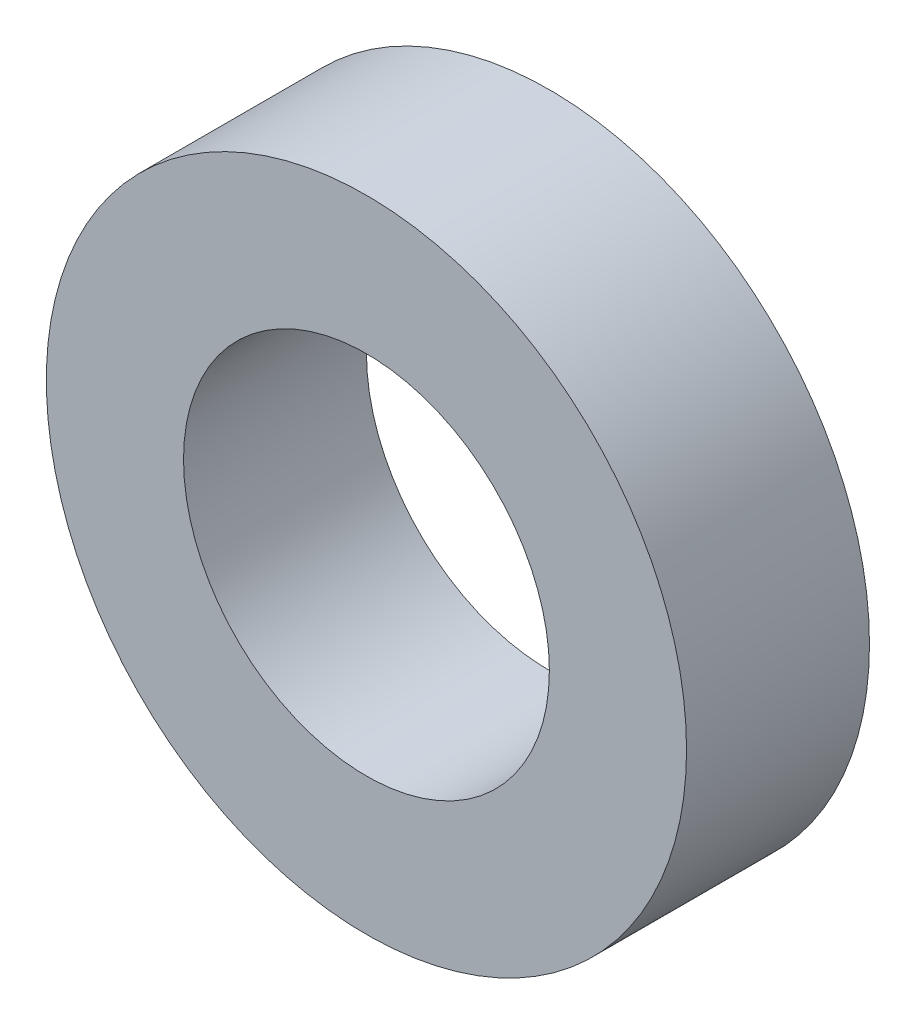
ISO-10303-21;
HEADER;
FILE_DESCRIPTION(('STEP AP214'),'2;1');
FILE_NAME('part.step','',(''),(''),'','','');
FILE_SCHEMA(('AUTOMOTIVE_DESIGN { 1 0 10303 214 1 1 1 1 }'));
ENDSEC;
DATA;
#1=APPLICATION_CONTEXT('core data for automotive mechanical design processes');
#2=APPLICATION_PROTOCOL_DEFINITION('international standard','automotive_design',2000,#1);
#3=PRODUCT_CONTEXT('',#1,'mechanical');
#4=PRODUCT('Part','Part','',(#3));
#5=PRODUCT_RELATED_PRODUCT_CATEGORY('part','',(#4));
#6=PRODUCT_DEFINITION_FORMATION('','',#4);
#7=PRODUCT_DEFINITION_CONTEXT('part definition',#1,'design');
#8=PRODUCT_DEFINITION('design','',#6,#7);
#9=PRODUCT_DEFINITION_SHAPE('','',#8);
#10=(LENGTH_UNIT() NAMED_UNIT(*) SI_UNIT(.MILLI.,.METRE.));
#11=(NAMED_UNIT(*) PLANE_ANGLE_UNIT() SI_UNIT($,.RADIAN.));
#12=(NAMED_UNIT(*) SI_UNIT($,.STERADIAN.) SOLID_ANGLE_UNIT());
#13=UNCERTAINTY_MEASURE_WITH_UNIT(LENGTH_MEASURE(1.E-05),#10,'distance_accuracy_value','');
#14=(GEOMETRIC_REPRESENTATION_CONTEXT(3) GLOBAL_UNCERTAINTY_ASSIGNED_CONTEXT((#13)) GLOBAL_UNIT_ASSIGNED_CONTEXT((#10,
#11,#12)) REPRESENTATION_CONTEXT('',''));
#15=CARTESIAN_POINT('',(0.,0.,0.));
#16=DIRECTION('',(0.,0.,1.));
#17=DIRECTION('',(1.,0.,0.));
#18=AXIS2_PLACEMENT_3D('',#15,#16,#17);
#19=CARTESIAN_POINT('',(0.,0.,1.));
#20=DIRECTION('',(0.,0.,1.));
#21=DIRECTION('',(1.,0.,0.));
#22=AXIS2_PLACEMENT_3D('',#19,#20,#21);
#23=PLANE('',#22);
#24=CARTESIAN_POINT('',(0.,0.,1.));
#25=DIRECTION('',(0.,0.,1.));
#26=DIRECTION('',(1.,0.,0.));
#27=AXIS2_PLACEMENT_3D('',#24,#25,#26);
#28=CIRCLE('',#27,3.5);
#29=CARTESIAN_POINT('',(3.5,0.,1.));
#30=VERTEX_POINT('',#29);
#31=EDGE_CURVE('E10',#30,#30,#28,.T.);
#32=ORIENTED_EDGE('',*,*,#31,.T.);
#33=EDGE_LOOP('',(#32));
#34=FACE_BOUND('',#33,.T.);
#35=CARTESIAN_POINT('',(0.,0.,1.));
#36=DIRECTION('',(0.,0.,1.));
#37=DIRECTION('',(1.,0.,0.));
#38=AXIS2_PLACEMENT_3D('',#35,#36,#37);
#39=CIRCLE('',#38,2.);
#40=CARTESIAN_POINT('',(2.,0.,1.));
#41=VERTEX_POINT('',#40);
#42=EDGE_CURVE('E54',#41,#41,#39,.T.);
#43=ORIENTED_EDGE('',*,*,#42,.F.);
#44=EDGE_LOOP('',(#43));
#45=FACE_BOUND('',#44,.T.);
#46=ADVANCED_FACE('F41',(#34,#45),#23,.T.);
#47=CARTESIAN_POINT('',(0.,0.,-1.));
#48=DIRECTION('',(0.,0.,1.));
#49=DIRECTION('',(1.,0.,0.));
#50=AXIS2_PLACEMENT_3D('',#47,#48,#49);
#51=PLANE('',#50);
#52=CARTESIAN_POINT('',(0.,0.,-1.));
#53=DIRECTION('',(0.,0.,1.));
#54=DIRECTION('',(1.,0.,0.));
#55=AXIS2_PLACEMENT_3D('',#52,#53,#54);
#56=CIRCLE('',#55,3.5);
#57=CARTESIAN_POINT('',(3.5,0.,-1.));
#58=VERTEX_POINT('',#57);
#59=EDGE_CURVE('E45',#58,#58,#56,.T.);
#60=ORIENTED_EDGE('',*,*,#59,.F.);
#61=EDGE_LOOP('',(#60));
#62=FACE_BOUND('',#61,.T.);
#63=CARTESIAN_POINT('',(0.,0.,-1.));
#64=DIRECTION('',(0.,0.,1.));
#65=DIRECTION('',(1.,0.,0.));
#66=AXIS2_PLACEMENT_3D('',#63,#64,#65);
#67=CIRCLE('',#66,2.);
#68=CARTESIAN_POINT('',(2.,0.,-1.));
#69=VERTEX_POINT('',#68);
#70=EDGE_CURVE('E56',#69,#69,#67,.T.);
#71=ORIENTED_EDGE('',*,*,#70,.T.);
#72=EDGE_LOOP('',(#71));
#73=FACE_BOUND('',#72,.T.);
#74=ADVANCED_FACE('F68',(#62,#73),#51,.F.);
#75=CARTESIAN_POINT('',(0.,0.,1.));
#76=DIRECTION('',(0.,0.,-1.));
#77=DIRECTION('',(-1.,0.,0.));
#78=AXIS2_PLACEMENT_3D('',#75,#76,#77);
#79=CYLINDRICAL_SURFACE('',#78,3.5);
#80=ORIENTED_EDGE('',*,*,#31,.F.);
#81=EDGE_LOOP('',(#80));
#82=FACE_BOUND('',#81,.T.);
#83=ORIENTED_EDGE('',*,*,#59,.T.);
#84=EDGE_LOOP('',(#83));
#85=FACE_BOUND('',#84,.T.);
#86=ADVANCED_FACE('F43',(#82,#85),#79,.T.);
#87=CARTESIAN_POINT('',(0.,0.,1.));
#88=DIRECTION('',(0.,0.,-1.));
#89=DIRECTION('',(-1.,0.,0.));
#90=AXIS2_PLACEMENT_3D('',#87,#88,#89);
#91=CYLINDRICAL_SURFACE('',#90,2.);
#92=ORIENTED_EDGE('',*,*,#42,.T.);
#93=EDGE_LOOP('',(#92));
#94=FACE_BOUND('',#93,.T.);
#95=ORIENTED_EDGE('',*,*,#70,.F.);
#96=EDGE_LOOP('',(#95));
#97=FACE_BOUND('',#96,.T.);
#98=ADVANCED_FACE('F64',(#94,#97),#91,.F.);
#99=CLOSED_SHELL('',(#46,#74,#86,#98));
#100=MANIFOLD_SOLID_BREP('B2',#99);
#101=ADVANCED_BREP_SHAPE_REPRESENTATION('',(#18,#100),#14);
#102=SHAPE_DEFINITION_REPRESENTATION(#9,#101);
ENDSEC;
END-ISO-10303-21;
